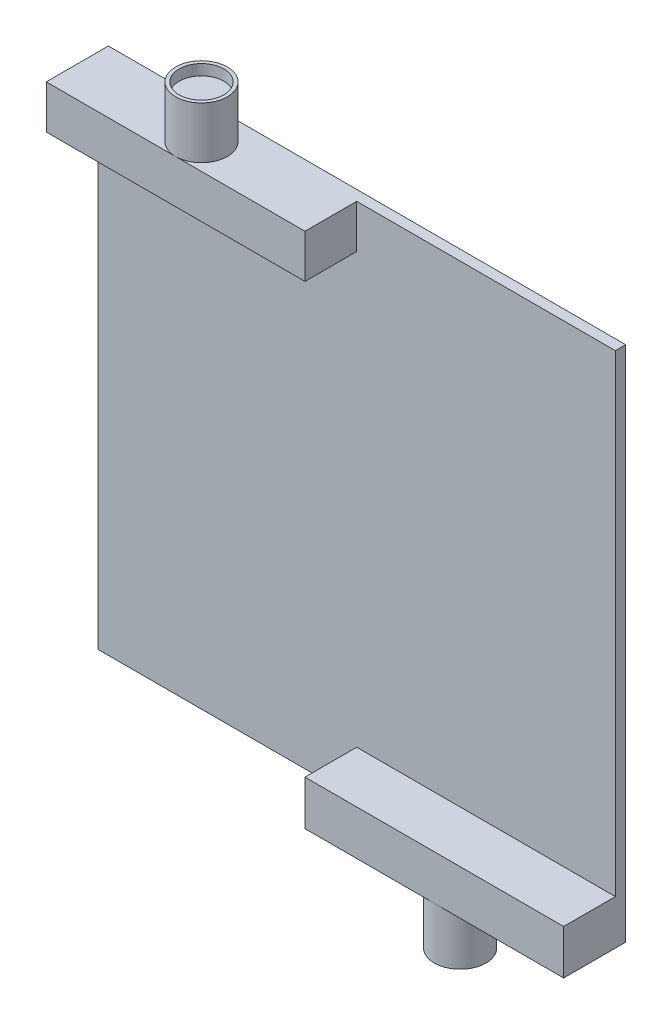
ISO-10303-21;
HEADER;
FILE_DESCRIPTION(('STEP AP214'),'2;1');
FILE_NAME('part.step','',(''),(''),'','','');
FILE_SCHEMA(('AUTOMOTIVE_DESIGN { 1 0 10303 214 1 1 1 1 }'));
ENDSEC;
DATA;
#1=APPLICATION_CONTEXT('core data for automotive mechanical design processes');
#2=APPLICATION_PROTOCOL_DEFINITION('international standard','automotive_design',2000,#1);
#3=PRODUCT_CONTEXT('',#1,'mechanical');
#4=PRODUCT('Part','Part','',(#3));
#5=PRODUCT_RELATED_PRODUCT_CATEGORY('part','',(#4));
#6=PRODUCT_DEFINITION_FORMATION('','',#4);
#7=PRODUCT_DEFINITION_CONTEXT('part definition',#1,'design');
#8=PRODUCT_DEFINITION('design','',#6,#7);
#9=PRODUCT_DEFINITION_SHAPE('','',#8);
#10=(LENGTH_UNIT() NAMED_UNIT(*) SI_UNIT(.MILLI.,.METRE.));
#11=(NAMED_UNIT(*) PLANE_ANGLE_UNIT() SI_UNIT($,.RADIAN.));
#12=(NAMED_UNIT(*) SI_UNIT($,.STERADIAN.) SOLID_ANGLE_UNIT());
#13=UNCERTAINTY_MEASURE_WITH_UNIT(LENGTH_MEASURE(1.E-05),#10,'distance_accuracy_value','');
#14=(GEOMETRIC_REPRESENTATION_CONTEXT(3) GLOBAL_UNCERTAINTY_ASSIGNED_CONTEXT((#13)) GLOBAL_UNIT_ASSIGNED_CONTEXT((#10,
#11,#12)) REPRESENTATION_CONTEXT('',''));
#15=CARTESIAN_POINT('',(0.,0.,0.));
#16=DIRECTION('',(0.,0.,1.));
#17=DIRECTION('',(1.,0.,0.));
#18=AXIS2_PLACEMENT_3D('',#15,#16,#17);
#19=CARTESIAN_POINT('',(0.,0.,3.));
#20=DIRECTION('',(0.,0.,-1.));
#21=DIRECTION('',(-1.,0.,0.));
#22=AXIS2_PLACEMENT_3D('',#19,#20,#21);
#23=PLANE('',#22);
#24=DIRECTION('',(-1.,0.,0.));
#25=VECTOR('',#24,1.);
#26=CARTESIAN_POINT('',(75.,-62.059544417906,3.));
#27=LINE('',#26,#25);
#28=CARTESIAN_POINT('',(75.,-62.059544417906,3.));
#29=VERTEX_POINT('',#28);
#30=CARTESIAN_POINT('',(0.,-62.059544417906,3.));
#31=VERTEX_POINT('',#30);
#32=EDGE_CURVE('E54',#29,#31,#27,.T.);
#33=ORIENTED_EDGE('',*,*,#32,.F.);
#34=DIRECTION('',(0.,1.,0.));
#35=VECTOR('',#34,1.);
#36=CARTESIAN_POINT('',(75.,-75.,3.));
#37=LINE('',#36,#35);
#38=CARTESIAN_POINT('',(75.,75.,3.));
#39=VERTEX_POINT('',#38);
#40=EDGE_CURVE('E188',#29,#39,#37,.T.);
#41=ORIENTED_EDGE('',*,*,#40,.T.);
#42=DIRECTION('',(-1.,0.,0.));
#43=VECTOR('',#42,1.);
#44=CARTESIAN_POINT('',(-75.,75.,3.));
#45=LINE('',#44,#43);
#46=CARTESIAN_POINT('',(0.,75.,3.));
#47=VERTEX_POINT('',#46);
#48=EDGE_CURVE('E190',#39,#47,#45,.T.);
#49=ORIENTED_EDGE('',*,*,#48,.T.);
#50=DIRECTION('',(0.,1.,0.));
#51=VECTOR('',#50,1.);
#52=CARTESIAN_POINT('',(0.,75.,3.));
#53=LINE('',#52,#51);
#54=CARTESIAN_POINT('',(0.,62.4039015801827,3.));
#55=VERTEX_POINT('',#54);
#56=EDGE_CURVE('E160',#55,#47,#53,.T.);
#57=ORIENTED_EDGE('',*,*,#56,.F.);
#58=DIRECTION('',(1.,0.,0.));
#59=VECTOR('',#58,1.);
#60=CARTESIAN_POINT('',(0.,62.4039015801827,3.));
#61=LINE('',#60,#59);
#62=CARTESIAN_POINT('',(-75.,62.4039015801827,3.));
#63=VERTEX_POINT('',#62);
#64=EDGE_CURVE('E167',#63,#55,#61,.T.);
#65=ORIENTED_EDGE('',*,*,#64,.F.);
#66=DIRECTION('',(0.,-1.,0.));
#67=VECTOR('',#66,1.);
#68=CARTESIAN_POINT('',(-75.,-75.,3.));
#69=LINE('',#68,#67);
#70=CARTESIAN_POINT('',(-75.,-75.,3.));
#71=VERTEX_POINT('',#70);
#72=EDGE_CURVE('E193',#63,#71,#69,.T.);
#73=ORIENTED_EDGE('',*,*,#72,.T.);
#74=DIRECTION('',(1.,0.,0.));
#75=VECTOR('',#74,1.);
#76=CARTESIAN_POINT('',(-75.,-75.,3.));
#77=LINE('',#76,#75);
#78=CARTESIAN_POINT('',(0.,-75.,3.));
#79=VERTEX_POINT('',#78);
#80=EDGE_CURVE('E195',#71,#79,#77,.T.);
#81=ORIENTED_EDGE('',*,*,#80,.T.);
#82=DIRECTION('',(0.,-1.,0.));
#83=VECTOR('',#82,1.);
#84=CARTESIAN_POINT('',(0.,-75.,3.));
#85=LINE('',#84,#83);
#86=EDGE_CURVE('E50',#31,#79,#85,.T.);
#87=ORIENTED_EDGE('',*,*,#86,.F.);
#88=EDGE_LOOP('',(#33,#41,#49,#57,#65,#73,#81,#87));
#89=FACE_BOUND('',#88,.T.);
#90=ADVANCED_FACE('F35',(#89),#23,.F.);
#91=CARTESIAN_POINT('',(75.,-75.,3.));
#92=DIRECTION('',(-1.,0.,0.));
#93=DIRECTION('',(0.,0.,1.));
#94=AXIS2_PLACEMENT_3D('',#91,#92,#93);
#95=PLANE('',#94);
#96=DIRECTION('',(0.,1.,0.));
#97=VECTOR('',#96,1.);
#98=CARTESIAN_POINT('',(75.,-75.,0.));
#99=LINE('',#98,#97);
#100=CARTESIAN_POINT('',(75.,-75.,0.));
#101=VERTEX_POINT('',#100);
#102=CARTESIAN_POINT('',(75.,75.,0.));
#103=VERTEX_POINT('',#102);
#104=EDGE_CURVE('E187',#101,#103,#99,.T.);
#105=ORIENTED_EDGE('',*,*,#104,.T.);
#106=DIRECTION('',(0.,0.,-1.));
#107=VECTOR('',#106,1.);
#108=CARTESIAN_POINT('',(75.,75.,3.));
#109=LINE('',#108,#107);
#110=EDGE_CURVE('E11',#39,#103,#109,.T.);
#111=ORIENTED_EDGE('',*,*,#110,.F.);
#112=ORIENTED_EDGE('',*,*,#40,.F.);
#113=DIRECTION('',(0.,0.,-1.));
#114=VECTOR('',#113,1.);
#115=CARTESIAN_POINT('',(75.,-62.059544417906,18.));
#116=LINE('',#115,#114);
#117=CARTESIAN_POINT('',(75.,-62.059544417906,18.));
#118=VERTEX_POINT('',#117);
#119=EDGE_CURVE('E147',#118,#29,#116,.T.);
#120=ORIENTED_EDGE('',*,*,#119,.F.);
#121=DIRECTION('',(0.,1.,0.));
#122=VECTOR('',#121,1.);
#123=CARTESIAN_POINT('',(75.,-75.,18.));
#124=LINE('',#123,#122);
#125=CARTESIAN_POINT('',(75.,-75.,18.));
#126=VERTEX_POINT('',#125);
#127=EDGE_CURVE('E142',#126,#118,#124,.T.);
#128=ORIENTED_EDGE('',*,*,#127,.F.);
#129=DIRECTION('',(0.,0.,-1.));
#130=VECTOR('',#129,1.);
#131=CARTESIAN_POINT('',(75.,-75.,3.));
#132=LINE('',#131,#130);
#133=EDGE_CURVE('E133',#126,#101,#132,.T.);
#134=ORIENTED_EDGE('',*,*,#133,.T.);
#135=EDGE_LOOP('',(#105,#111,#112,#120,#128,#134));
#136=FACE_BOUND('',#135,.T.);
#137=ADVANCED_FACE('F37',(#136),#95,.F.);
#138=CARTESIAN_POINT('',(-75.,75.,3.));
#139=DIRECTION('',(0.,-1.,0.));
#140=DIRECTION('',(0.,0.,-1.));
#141=AXIS2_PLACEMENT_3D('',#138,#139,#140);
#142=PLANE('',#141);
#143=DIRECTION('',(-1.,0.,0.));
#144=VECTOR('',#143,1.);
#145=CARTESIAN_POINT('',(0.,75.,18.));
#146=LINE('',#145,#144);
#147=CARTESIAN_POINT('',(-37.5,75.,17.9999999999999));
#148=VERTEX_POINT('',#147);
#149=CARTESIAN_POINT('',(-75.,75.,18.));
#150=VERTEX_POINT('',#149);
#151=EDGE_CURVE('E166',#148,#150,#146,.T.);
#152=ORIENTED_EDGE('',*,*,#151,.F.);
#153=CARTESIAN_POINT('',(-37.5,75.,10.5));
#154=DIRECTION('',(0.,1.,0.));
#155=DIRECTION('',(0.,0.,1.));
#156=AXIS2_PLACEMENT_3D('',#153,#154,#155);
#157=CIRCLE('',#156,7.49999999999995);
#158=EDGE_CURVE('E154',#148,#148,#157,.T.);
#159=ORIENTED_EDGE('',*,*,#158,.F.);
#160=CARTESIAN_POINT('',(0.,75.,18.));
#161=VERTEX_POINT('',#160);
#162=EDGE_CURVE('E168',#161,#148,#146,.T.);
#163=ORIENTED_EDGE('',*,*,#162,.F.);
#164=DIRECTION('',(0.,0.,-1.));
#165=VECTOR('',#164,1.);
#166=CARTESIAN_POINT('',(0.,75.,18.));
#167=LINE('',#166,#165);
#168=EDGE_CURVE('E184',#161,#47,#167,.T.);
#169=ORIENTED_EDGE('',*,*,#168,.T.);
#170=ORIENTED_EDGE('',*,*,#48,.F.);
#171=ORIENTED_EDGE('',*,*,#110,.T.);
#172=DIRECTION('',(-1.,0.,0.));
#173=VECTOR('',#172,1.);
#174=CARTESIAN_POINT('',(-75.,75.,0.));
#175=LINE('',#174,#173);
#176=CARTESIAN_POINT('',(-75.,75.,0.));
#177=VERTEX_POINT('',#176);
#178=EDGE_CURVE('E199',#103,#177,#175,.T.);
#179=ORIENTED_EDGE('',*,*,#178,.T.);
#180=DIRECTION('',(0.,0.,-1.));
#181=VECTOR('',#180,1.);
#182=CARTESIAN_POINT('',(-75.,75.,3.));
#183=LINE('',#182,#181);
#184=EDGE_CURVE('E43',#150,#177,#183,.T.);
#185=ORIENTED_EDGE('',*,*,#184,.F.);
#186=EDGE_LOOP('',(#152,#159,#163,#169,#170,#171,#179,#185));
#187=FACE_BOUND('',#186,.T.);
#188=ADVANCED_FACE('F265',(#187),#142,.F.);
#189=CARTESIAN_POINT('',(-75.,-75.,3.));
#190=DIRECTION('',(1.,0.,0.));
#191=DIRECTION('',(0.,0.,-1.));
#192=AXIS2_PLACEMENT_3D('',#189,#190,#191);
#193=PLANE('',#192);
#194=DIRECTION('',(0.,-1.,0.));
#195=VECTOR('',#194,1.);
#196=CARTESIAN_POINT('',(-75.,-75.,0.));
#197=LINE('',#196,#195);
#198=CARTESIAN_POINT('',(-75.,-75.,0.));
#199=VERTEX_POINT('',#198);
#200=EDGE_CURVE('E201',#177,#199,#197,.T.);
#201=ORIENTED_EDGE('',*,*,#200,.T.);
#202=DIRECTION('',(0.,0.,-1.));
#203=VECTOR('',#202,1.);
#204=CARTESIAN_POINT('',(-75.,-75.,3.));
#205=LINE('',#204,#203);
#206=EDGE_CURVE('E205',#71,#199,#205,.T.);
#207=ORIENTED_EDGE('',*,*,#206,.F.);
#208=ORIENTED_EDGE('',*,*,#72,.F.);
#209=DIRECTION('',(0.,0.,-1.));
#210=VECTOR('',#209,1.);
#211=CARTESIAN_POINT('',(-75.,62.4039015801827,18.));
#212=LINE('',#211,#210);
#213=CARTESIAN_POINT('',(-75.,62.4039015801827,18.));
#214=VERTEX_POINT('',#213);
#215=EDGE_CURVE('E181',#214,#63,#212,.T.);
#216=ORIENTED_EDGE('',*,*,#215,.F.);
#217=DIRECTION('',(0.,-1.,0.));
#218=VECTOR('',#217,1.);
#219=CARTESIAN_POINT('',(-75.,75.,18.));
#220=LINE('',#219,#218);
#221=EDGE_CURVE('E170',#150,#214,#220,.T.);
#222=ORIENTED_EDGE('',*,*,#221,.F.);
#223=ORIENTED_EDGE('',*,*,#184,.T.);
#224=EDGE_LOOP('',(#201,#207,#208,#216,#222,#223));
#225=FACE_BOUND('',#224,.T.);
#226=ADVANCED_FACE('F212',(#225),#193,.F.);
#227=CARTESIAN_POINT('',(-75.,-75.,3.));
#228=DIRECTION('',(0.,1.,0.));
#229=DIRECTION('',(0.,0.,1.));
#230=AXIS2_PLACEMENT_3D('',#227,#228,#229);
#231=PLANE('',#230);
#232=DIRECTION('',(1.,0.,0.));
#233=VECTOR('',#232,1.);
#234=CARTESIAN_POINT('',(75.,-75.,18.));
#235=LINE('',#234,#233);
#236=CARTESIAN_POINT('',(37.5,-75.,18.));
#237=VERTEX_POINT('',#236);
#238=EDGE_CURVE('E119',#237,#126,#235,.T.);
#239=ORIENTED_EDGE('',*,*,#238,.F.);
#240=CARTESIAN_POINT('',(37.5,-75.,10.5));
#241=DIRECTION('',(0.,-1.,0.));
#242=DIRECTION('',(0.,0.,-1.));
#243=AXIS2_PLACEMENT_3D('',#240,#241,#242);
#244=CIRCLE('',#243,7.49999999999996);
#245=EDGE_CURVE('E131',#237,#237,#244,.T.);
#246=ORIENTED_EDGE('',*,*,#245,.F.);
#247=CARTESIAN_POINT('',(0.,-75.,18.));
#248=VERTEX_POINT('',#247);
#249=EDGE_CURVE('E115',#248,#237,#235,.T.);
#250=ORIENTED_EDGE('',*,*,#249,.F.);
#251=DIRECTION('',(0.,0.,-1.));
#252=VECTOR('',#251,1.);
#253=CARTESIAN_POINT('',(0.,-75.,18.));
#254=LINE('',#253,#252);
#255=EDGE_CURVE('E127',#248,#79,#254,.T.);
#256=ORIENTED_EDGE('',*,*,#255,.T.);
#257=ORIENTED_EDGE('',*,*,#80,.F.);
#258=ORIENTED_EDGE('',*,*,#206,.T.);
#259=DIRECTION('',(1.,0.,0.));
#260=VECTOR('',#259,1.);
#261=CARTESIAN_POINT('',(-75.,-75.,0.));
#262=LINE('',#261,#260);
#263=EDGE_CURVE('E191',#199,#101,#262,.T.);
#264=ORIENTED_EDGE('',*,*,#263,.T.);
#265=ORIENTED_EDGE('',*,*,#133,.F.);
#266=EDGE_LOOP('',(#239,#246,#250,#256,#257,#258,#264,#265));
#267=FACE_BOUND('',#266,.T.);
#268=ADVANCED_FACE('F129',(#267),#231,.F.);
#269=CARTESIAN_POINT('',(0.,0.,0.));
#270=DIRECTION('',(0.,0.,-1.));
#271=DIRECTION('',(-1.,0.,0.));
#272=AXIS2_PLACEMENT_3D('',#269,#270,#271);
#273=PLANE('',#272);
#274=ORIENTED_EDGE('',*,*,#104,.F.);
#275=ORIENTED_EDGE('',*,*,#263,.F.);
#276=ORIENTED_EDGE('',*,*,#200,.F.);
#277=ORIENTED_EDGE('',*,*,#178,.F.);
#278=EDGE_LOOP('',(#274,#275,#276,#277));
#279=FACE_BOUND('',#278,.T.);
#280=ADVANCED_FACE('F220',(#279),#273,.T.);
#281=CARTESIAN_POINT('',(0.,75.,18.));
#282=DIRECTION('',(-1.,0.,0.));
#283=DIRECTION('',(0.,0.,1.));
#284=AXIS2_PLACEMENT_3D('',#281,#282,#283);
#285=PLANE('',#284);
#286=ORIENTED_EDGE('',*,*,#56,.T.);
#287=ORIENTED_EDGE('',*,*,#168,.F.);
#288=DIRECTION('',(0.,1.,0.));
#289=VECTOR('',#288,1.);
#290=CARTESIAN_POINT('',(0.,75.,18.));
#291=LINE('',#290,#289);
#292=CARTESIAN_POINT('',(0.,62.4039015801827,18.));
#293=VERTEX_POINT('',#292);
#294=EDGE_CURVE('E163',#293,#161,#291,.T.);
#295=ORIENTED_EDGE('',*,*,#294,.F.);
#296=DIRECTION('',(0.,0.,-1.));
#297=VECTOR('',#296,1.);
#298=CARTESIAN_POINT('',(0.,62.4039015801827,18.));
#299=LINE('',#298,#297);
#300=EDGE_CURVE('E174',#293,#55,#299,.T.);
#301=ORIENTED_EDGE('',*,*,#300,.T.);
#302=EDGE_LOOP('',(#286,#287,#295,#301));
#303=FACE_BOUND('',#302,.T.);
#304=ADVANCED_FACE('F268',(#303),#285,.F.);
#305=CARTESIAN_POINT('',(0.,62.4039015801827,18.));
#306=DIRECTION('',(0.,1.,0.));
#307=DIRECTION('',(0.,0.,1.));
#308=AXIS2_PLACEMENT_3D('',#305,#306,#307);
#309=PLANE('',#308);
#310=ORIENTED_EDGE('',*,*,#64,.T.);
#311=ORIENTED_EDGE('',*,*,#300,.F.);
#312=DIRECTION('',(1.,0.,0.));
#313=VECTOR('',#312,1.);
#314=CARTESIAN_POINT('',(0.,62.4039015801827,18.));
#315=LINE('',#314,#313);
#316=EDGE_CURVE('E172',#214,#293,#315,.T.);
#317=ORIENTED_EDGE('',*,*,#316,.F.);
#318=ORIENTED_EDGE('',*,*,#215,.T.);
#319=EDGE_LOOP('',(#310,#311,#317,#318));
#320=FACE_BOUND('',#319,.T.);
#321=ADVANCED_FACE('F288',(#320),#309,.F.);
#322=CARTESIAN_POINT('',(0.,0.,18.));
#323=DIRECTION('',(0.,0.,-1.));
#324=DIRECTION('',(-1.,0.,0.));
#325=AXIS2_PLACEMENT_3D('',#322,#323,#324);
#326=PLANE('',#325);
#327=ORIENTED_EDGE('',*,*,#294,.T.);
#328=ORIENTED_EDGE('',*,*,#162,.T.);
#329=ORIENTED_EDGE('',*,*,#151,.T.);
#330=ORIENTED_EDGE('',*,*,#221,.T.);
#331=ORIENTED_EDGE('',*,*,#316,.T.);
#332=EDGE_LOOP('',(#327,#328,#329,#330,#331));
#333=FACE_BOUND('',#332,.T.);
#334=ADVANCED_FACE('F280',(#333),#326,.F.);
#335=CARTESIAN_POINT('',(-37.5,90.,10.5));
#336=DIRECTION('',(0.,-1.,0.));
#337=DIRECTION('',(0.,0.,-1.));
#338=AXIS2_PLACEMENT_3D('',#335,#336,#337);
#339=CYLINDRICAL_SURFACE('',#338,7.49999999999995);
#340=CARTESIAN_POINT('',(-37.5,90.,10.5));
#341=DIRECTION('',(0.,1.,0.));
#342=DIRECTION('',(0.,0.,1.));
#343=AXIS2_PLACEMENT_3D('',#340,#341,#342);
#344=CIRCLE('',#343,7.49999999999995);
#345=CARTESIAN_POINT('',(-37.5,90.,17.9999999999999));
#346=VERTEX_POINT('',#345);
#347=EDGE_CURVE('E157',#346,#346,#344,.T.);
#348=ORIENTED_EDGE('',*,*,#347,.F.);
#349=EDGE_LOOP('',(#348));
#350=FACE_BOUND('',#349,.T.);
#351=ORIENTED_EDGE('',*,*,#158,.T.);
#352=EDGE_LOOP('',(#351));
#353=FACE_BOUND('',#352,.T.);
#354=ADVANCED_FACE('F312',(#350,#353),#339,.T.);
#355=CARTESIAN_POINT('',(-37.5,90.,10.5));
#356=DIRECTION('',(0.,1.,0.));
#357=DIRECTION('',(0.,0.,1.));
#358=AXIS2_PLACEMENT_3D('',#355,#356,#357);
#359=PLANE('',#358);
#360=CARTESIAN_POINT('',(-37.5,90.,10.5));
#361=DIRECTION('',(0.,1.,0.));
#362=DIRECTION('',(0.,0.,1.));
#363=AXIS2_PLACEMENT_3D('',#360,#361,#362);
#364=CIRCLE('',#363,6.5);
#365=CARTESIAN_POINT('',(-37.5,90.,17.));
#366=VERTEX_POINT('',#365);
#367=EDGE_CURVE('E150',#366,#366,#364,.T.);
#368=ORIENTED_EDGE('',*,*,#367,.F.);
#369=EDGE_LOOP('',(#368));
#370=FACE_BOUND('',#369,.T.);
#371=ORIENTED_EDGE('',*,*,#347,.T.);
#372=EDGE_LOOP('',(#371));
#373=FACE_BOUND('',#372,.T.);
#374=ADVANCED_FACE('F308',(#370,#373),#359,.T.);
#375=CARTESIAN_POINT('',(-37.5,86.9,10.5));
#376=DIRECTION('',(0.,1.,0.));
#377=DIRECTION('',(0.,0.,1.));
#378=AXIS2_PLACEMENT_3D('',#375,#376,#377);
#379=CYLINDRICAL_SURFACE('',#378,6.5);
#380=CARTESIAN_POINT('',(-37.5,86.9,10.5));
#381=DIRECTION('',(0.,1.,0.));
#382=DIRECTION('',(0.,0.,1.));
#383=AXIS2_PLACEMENT_3D('',#380,#381,#382);
#384=CIRCLE('',#383,6.5);
#385=CARTESIAN_POINT('',(-37.5,86.9,17.));
#386=VERTEX_POINT('',#385);
#387=EDGE_CURVE('E151',#386,#386,#384,.T.);
#388=CARTESIAN_POINT('',(-37.5,86.9,17.));
#389=CARTESIAN_POINT('',(-37.5,86.9322916666666,17.));
#390=CARTESIAN_POINT('',(-37.5,86.9645833333333,17.));
#391=CARTESIAN_POINT('',(-37.5,87.0291666666666,17.));
#392=CARTESIAN_POINT('',(-37.5,87.0614583333333,17.));
#393=CARTESIAN_POINT('',(-37.5,87.1260416666666,17.));
#394=CARTESIAN_POINT('',(-37.5,87.1583333333333,17.));
#395=CARTESIAN_POINT('',(-37.5,87.2229166666666,17.));
#396=CARTESIAN_POINT('',(-37.5,87.2552083333333,17.));
#397=CARTESIAN_POINT('',(-37.5,87.3197916666666,17.));
#398=CARTESIAN_POINT('',(-37.5,87.3520833333333,17.));
#399=CARTESIAN_POINT('',(-37.5,87.4166666666666,17.));
#400=CARTESIAN_POINT('',(-37.5,87.4489583333333,17.));
#401=CARTESIAN_POINT('',(-37.5,87.5135416666666,17.));
#402=CARTESIAN_POINT('',(-37.5,87.5458333333333,17.));
#403=CARTESIAN_POINT('',(-37.5,87.6104166666666,17.));
#404=CARTESIAN_POINT('',(-37.5,87.6427083333333,17.));
#405=CARTESIAN_POINT('',(-37.5,87.7072916666666,17.));
#406=CARTESIAN_POINT('',(-37.5,87.7395833333333,17.));
#407=CARTESIAN_POINT('',(-37.5,87.8041666666666,17.));
#408=CARTESIAN_POINT('',(-37.5,87.8364583333333,17.));
#409=CARTESIAN_POINT('',(-37.5,87.9010416666666,17.));
#410=CARTESIAN_POINT('',(-37.5,87.9333333333333,17.));
#411=CARTESIAN_POINT('',(-37.5,87.9979166666667,17.));
#412=CARTESIAN_POINT('',(-37.5,88.0302083333333,17.));
#413=CARTESIAN_POINT('',(-37.5,88.0947916666666,17.));
#414=CARTESIAN_POINT('',(-37.5,88.1270833333333,17.));
#415=CARTESIAN_POINT('',(-37.5,88.1916666666666,17.));
#416=CARTESIAN_POINT('',(-37.5,88.2239583333333,17.));
#417=CARTESIAN_POINT('',(-37.5,88.2885416666666,17.));
#418=CARTESIAN_POINT('',(-37.5,88.3208333333333,17.));
#419=CARTESIAN_POINT('',(-37.5,88.3854166666666,17.));
#420=CARTESIAN_POINT('',(-37.5,88.4177083333333,17.));
#421=CARTESIAN_POINT('',(-37.5,88.4822916666666,17.));
#422=CARTESIAN_POINT('',(-37.5,88.5145833333333,17.));
#423=CARTESIAN_POINT('',(-37.5,88.5791666666666,17.));
#424=CARTESIAN_POINT('',(-37.5,88.6114583333333,17.));
#425=CARTESIAN_POINT('',(-37.5,88.6760416666666,17.));
#426=CARTESIAN_POINT('',(-37.5,88.7083333333333,17.));
#427=CARTESIAN_POINT('',(-37.5,88.7729166666666,17.));
#428=CARTESIAN_POINT('',(-37.5,88.8052083333333,17.));
#429=CARTESIAN_POINT('',(-37.5,88.8697916666666,17.));
#430=CARTESIAN_POINT('',(-37.5,88.9020833333333,17.));
#431=CARTESIAN_POINT('',(-37.5,88.9666666666666,17.));
#432=CARTESIAN_POINT('',(-37.5,88.9989583333333,17.));
#433=CARTESIAN_POINT('',(-37.5,89.0635416666667,17.));
#434=CARTESIAN_POINT('',(-37.5,89.0958333333333,17.));
#435=CARTESIAN_POINT('',(-37.5,89.1604166666666,17.));
#436=CARTESIAN_POINT('',(-37.5,89.1927083333333,17.));
#437=CARTESIAN_POINT('',(-37.5,89.2572916666666,17.));
#438=CARTESIAN_POINT('',(-37.5,89.2895833333333,17.));
#439=CARTESIAN_POINT('',(-37.5,89.3541666666667,17.));
#440=CARTESIAN_POINT('',(-37.5,89.3864583333333,17.));
#441=CARTESIAN_POINT('',(-37.5,89.4510416666667,17.));
#442=CARTESIAN_POINT('',(-37.5,89.4833333333333,17.));
#443=CARTESIAN_POINT('',(-37.5,89.5479166666666,17.));
#444=CARTESIAN_POINT('',(-37.5,89.5802083333333,17.));
#445=CARTESIAN_POINT('',(-37.5,89.6447916666666,17.));
#446=CARTESIAN_POINT('',(-37.5,89.6770833333333,17.));
#447=CARTESIAN_POINT('',(-37.5,89.7416666666666,17.));
#448=CARTESIAN_POINT('',(-37.5,89.7739583333333,17.));
#449=CARTESIAN_POINT('',(-37.5,89.8385416666666,17.));
#450=CARTESIAN_POINT('',(-37.5,89.8708333333333,17.));
#451=CARTESIAN_POINT('',(-37.5,89.9354166666666,17.));
#452=CARTESIAN_POINT('',(-37.5,89.9677083333333,17.));
#453=CARTESIAN_POINT('',(-37.5,90.,17.));
#454=B_SPLINE_CURVE_WITH_KNOTS('',3,(#388,#389,#390,#391,#392,#393,#394,#395,#396,#397,#398,
#399,#400,#401,#402,#403,#404,#405,#406,#407,#408,#409,#410,#411,#412,#413,#414,#415,#416,#417,
#418,#419,#420,#421,#422,#423,#424,#425,#426,#427,#428,#429,#430,#431,#432,#433,#434,#435,#436,
#437,#438,#439,#440,#441,#442,#443,#444,#445,#446,#447,#448,#449,#450,#451,#452,#453),
.UNSPECIFIED.,.F.,.F.,(4,2,2,2,2,2,2,2,2,2,2,2,2,2,2,2,2,2,2,2,2,2,2,2,2,2,2,2,2,2,2,2,4),(0.,
0.0968750000000101,0.193750000000006,0.290625000000003,0.387500000000013,0.484375000000009,
0.581250000000005,0.678125000000002,0.775000000000012,0.871875000000008,0.968750000000004,
1.06562500000001,1.16250000000001,1.25937500000001,1.35625,1.45312500000001,1.55000000000001,
1.64687500000001,1.74375000000002,1.84062500000001,1.93750000000001,2.03437500000001,
2.13125000000002,2.22812500000001,2.32500000000001,2.42187500000002,2.51875000000001,
2.61562500000001,2.71250000000001,2.80937500000002,2.90625000000001,3.00312500000001,
3.10000000000002),.UNSPECIFIED.);
#455=EDGE_CURVE('BSEAM302',#386,#366,#454,.T.);
#456=ORIENTED_EDGE('',*,*,#387,.F.);
#457=ORIENTED_EDGE('',*,*,#367,.T.);
#458=ORIENTED_EDGE('',*,*,#455,.T.);
#459=ORIENTED_EDGE('',*,*,#455,.F.);
#460=EDGE_LOOP('',(#456,#458,#457,#459));
#461=FACE_BOUND('',#460,.T.);
#462=ADVANCED_FACE('F302',(#461),#379,.F.);
#463=CARTESIAN_POINT('',(-37.5,86.9,10.5));
#464=DIRECTION('',(0.,1.,0.));
#465=DIRECTION('',(0.,0.,1.));
#466=AXIS2_PLACEMENT_3D('',#463,#464,#465);
#467=PLANE('',#466);
#468=ORIENTED_EDGE('',*,*,#387,.T.);
#469=EDGE_LOOP('',(#468));
#470=FACE_BOUND('',#469,.T.);
#471=ADVANCED_FACE('F295',(#470),#467,.T.);
#472=CARTESIAN_POINT('',(75.,-62.059544417906,18.));
#473=DIRECTION('',(0.,-1.,0.));
#474=DIRECTION('',(0.,0.,-1.));
#475=AXIS2_PLACEMENT_3D('',#472,#473,#474);
#476=PLANE('',#475);
#477=ORIENTED_EDGE('',*,*,#32,.T.);
#478=DIRECTION('',(0.,0.,-1.));
#479=VECTOR('',#478,1.);
#480=CARTESIAN_POINT('',(0.,-62.059544417906,18.));
#481=LINE('',#480,#479);
#482=CARTESIAN_POINT('',(0.,-62.059544417906,18.));
#483=VERTEX_POINT('',#482);
#484=EDGE_CURVE('E144',#483,#31,#481,.T.);
#485=ORIENTED_EDGE('',*,*,#484,.F.);
#486=DIRECTION('',(-1.,0.,0.));
#487=VECTOR('',#486,1.);
#488=CARTESIAN_POINT('',(75.,-62.059544417906,18.));
#489=LINE('',#488,#487);
#490=EDGE_CURVE('E135',#118,#483,#489,.T.);
#491=ORIENTED_EDGE('',*,*,#490,.F.);
#492=ORIENTED_EDGE('',*,*,#119,.T.);
#493=EDGE_LOOP('',(#477,#485,#491,#492));
#494=FACE_BOUND('',#493,.T.);
#495=ADVANCED_FACE('F293',(#494),#476,.F.);
#496=CARTESIAN_POINT('',(0.,-75.,18.));
#497=DIRECTION('',(1.,0.,0.));
#498=DIRECTION('',(0.,0.,-1.));
#499=AXIS2_PLACEMENT_3D('',#496,#497,#498);
#500=PLANE('',#499);
#501=ORIENTED_EDGE('',*,*,#86,.T.);
#502=ORIENTED_EDGE('',*,*,#255,.F.);
#503=DIRECTION('',(0.,-1.,0.));
#504=VECTOR('',#503,1.);
#505=CARTESIAN_POINT('',(0.,-75.,18.));
#506=LINE('',#505,#504);
#507=EDGE_CURVE('E122',#483,#248,#506,.T.);
#508=ORIENTED_EDGE('',*,*,#507,.F.);
#509=ORIENTED_EDGE('',*,*,#484,.T.);
#510=EDGE_LOOP('',(#501,#502,#508,#509));
#511=FACE_BOUND('',#510,.T.);
#512=ADVANCED_FACE('F258',(#511),#500,.F.);
#513=CARTESIAN_POINT('',(0.,0.,18.));
#514=DIRECTION('',(0.,0.,1.));
#515=DIRECTION('',(1.,0.,0.));
#516=AXIS2_PLACEMENT_3D('',#513,#514,#515);
#517=PLANE('',#516);
#518=ORIENTED_EDGE('',*,*,#127,.T.);
#519=ORIENTED_EDGE('',*,*,#490,.T.);
#520=ORIENTED_EDGE('',*,*,#507,.T.);
#521=ORIENTED_EDGE('',*,*,#249,.T.);
#522=ORIENTED_EDGE('',*,*,#238,.T.);
#523=EDGE_LOOP('',(#518,#519,#520,#521,#522));
#524=FACE_BOUND('',#523,.T.);
#525=ADVANCED_FACE('F118',(#524),#517,.T.);
#526=CARTESIAN_POINT('',(37.5,-90.,10.5));
#527=DIRECTION('',(0.,1.,0.));
#528=DIRECTION('',(0.,0.,1.));
#529=AXIS2_PLACEMENT_3D('',#526,#527,#528);
#530=CYLINDRICAL_SURFACE('',#529,7.49999999999996);
#531=CARTESIAN_POINT('',(37.5,-90.,10.5));
#532=DIRECTION('',(0.,-1.,0.));
#533=DIRECTION('',(0.,0.,-1.));
#534=AXIS2_PLACEMENT_3D('',#531,#532,#533);
#535=CIRCLE('',#534,7.49999999999996);
#536=CARTESIAN_POINT('',(37.5,-90.,3.00000000000004));
#537=VERTEX_POINT('',#536);
#538=EDGE_CURVE('E140',#537,#537,#535,.T.);
#539=ORIENTED_EDGE('',*,*,#538,.F.);
#540=EDGE_LOOP('',(#539));
#541=FACE_BOUND('',#540,.T.);
#542=ORIENTED_EDGE('',*,*,#245,.T.);
#543=EDGE_LOOP('',(#542));
#544=FACE_BOUND('',#543,.T.);
#545=ADVANCED_FACE('F248',(#541,#544),#530,.T.);
#546=CARTESIAN_POINT('',(37.5,-90.,10.5));
#547=DIRECTION('',(0.,-1.,0.));
#548=DIRECTION('',(0.,0.,-1.));
#549=AXIS2_PLACEMENT_3D('',#546,#547,#548);
#550=PLANE('',#549);
#551=CARTESIAN_POINT('',(37.5,-90.,10.5));
#552=DIRECTION('',(0.,-1.,0.));
#553=DIRECTION('',(0.,0.,-1.));
#554=AXIS2_PLACEMENT_3D('',#551,#552,#553);
#555=CIRCLE('',#554,6.5);
#556=CARTESIAN_POINT('',(37.5,-90.,4.));
#557=VERTEX_POINT('',#556);
#558=EDGE_CURVE('E231',#557,#557,#555,.T.);
#559=ORIENTED_EDGE('',*,*,#558,.F.);
#560=EDGE_LOOP('',(#559));
#561=FACE_BOUND('',#560,.T.);
#562=ORIENTED_EDGE('',*,*,#538,.T.);
#563=EDGE_LOOP('',(#562));
#564=FACE_BOUND('',#563,.T.);
#565=ADVANCED_FACE('F242',(#561,#564),#550,.T.);
#566=CARTESIAN_POINT('',(37.5,-86.9,10.5));
#567=DIRECTION('',(0.,-1.,0.));
#568=DIRECTION('',(0.,0.,-1.));
#569=AXIS2_PLACEMENT_3D('',#566,#567,#568);
#570=CYLINDRICAL_SURFACE('',#569,6.5);
#571=CARTESIAN_POINT('',(37.5,-86.9,10.5));
#572=DIRECTION('',(0.,-1.,0.));
#573=DIRECTION('',(0.,0.,-1.));
#574=AXIS2_PLACEMENT_3D('',#571,#572,#573);
#575=CIRCLE('',#574,6.5);
#576=CARTESIAN_POINT('',(37.5,-86.9,4.));
#577=VERTEX_POINT('',#576);
#578=EDGE_CURVE('E228',#577,#577,#575,.T.);
#579=CARTESIAN_POINT('',(37.5,-86.9,4.));
#580=CARTESIAN_POINT('',(37.5,-86.9322916666667,4.));
#581=CARTESIAN_POINT('',(37.5,-86.9645833333333,4.));
#582=CARTESIAN_POINT('',(37.5,-87.0291666666667,4.));
#583=CARTESIAN_POINT('',(37.5,-87.0614583333333,4.));
#584=CARTESIAN_POINT('',(37.5,-87.1260416666667,4.));
#585=CARTESIAN_POINT('',(37.5,-87.1583333333333,4.));
#586=CARTESIAN_POINT('',(37.5,-87.2229166666667,4.));
#587=CARTESIAN_POINT('',(37.5,-87.2552083333333,4.));
#588=CARTESIAN_POINT('',(37.5,-87.3197916666667,4.));
#589=CARTESIAN_POINT('',(37.5,-87.3520833333333,4.));
#590=CARTESIAN_POINT('',(37.5,-87.4166666666667,4.));
#591=CARTESIAN_POINT('',(37.5,-87.4489583333333,4.));
#592=CARTESIAN_POINT('',(37.5,-87.5135416666667,4.));
#593=CARTESIAN_POINT('',(37.5,-87.5458333333333,4.));
#594=CARTESIAN_POINT('',(37.5,-87.6104166666667,4.));
#595=CARTESIAN_POINT('',(37.5,-87.6427083333333,4.));
#596=CARTESIAN_POINT('',(37.5,-87.7072916666667,4.));
#597=CARTESIAN_POINT('',(37.5,-87.7395833333333,4.));
#598=CARTESIAN_POINT('',(37.5,-87.8041666666667,4.));
#599=CARTESIAN_POINT('',(37.5,-87.8364583333333,4.));
#600=CARTESIAN_POINT('',(37.5,-87.9010416666667,4.));
#601=CARTESIAN_POINT('',(37.5,-87.9333333333333,4.));
#602=CARTESIAN_POINT('',(37.5,-87.9979166666667,4.));
#603=CARTESIAN_POINT('',(37.5,-88.0302083333333,4.));
#604=CARTESIAN_POINT('',(37.5,-88.0947916666667,4.));
#605=CARTESIAN_POINT('',(37.5,-88.1270833333333,4.));
#606=CARTESIAN_POINT('',(37.5,-88.1916666666667,4.));
#607=CARTESIAN_POINT('',(37.5,-88.2239583333333,4.));
#608=CARTESIAN_POINT('',(37.5,-88.2885416666667,4.));
#609=CARTESIAN_POINT('',(37.5,-88.3208333333333,4.));
#610=CARTESIAN_POINT('',(37.5,-88.3854166666667,4.));
#611=CARTESIAN_POINT('',(37.5,-88.4177083333333,4.));
#612=CARTESIAN_POINT('',(37.5,-88.4822916666667,4.));
#613=CARTESIAN_POINT('',(37.5,-88.5145833333333,4.));
#614=CARTESIAN_POINT('',(37.5,-88.5791666666667,4.));
#615=CARTESIAN_POINT('',(37.5,-88.6114583333333,4.));
#616=CARTESIAN_POINT('',(37.5,-88.6760416666667,4.));
#617=CARTESIAN_POINT('',(37.5,-88.7083333333333,4.));
#618=CARTESIAN_POINT('',(37.5,-88.7729166666667,4.));
#619=CARTESIAN_POINT('',(37.5,-88.8052083333333,4.));
#620=CARTESIAN_POINT('',(37.5,-88.8697916666667,4.));
#621=CARTESIAN_POINT('',(37.5,-88.9020833333333,4.));
#622=CARTESIAN_POINT('',(37.5,-88.9666666666667,4.));
#623=CARTESIAN_POINT('',(37.5,-88.9989583333333,4.));
#624=CARTESIAN_POINT('',(37.5,-89.0635416666667,4.));
#625=CARTESIAN_POINT('',(37.5,-89.0958333333333,4.));
#626=CARTESIAN_POINT('',(37.5,-89.1604166666667,4.));
#627=CARTESIAN_POINT('',(37.5,-89.1927083333333,4.));
#628=CARTESIAN_POINT('',(37.5,-89.2572916666667,4.));
#629=CARTESIAN_POINT('',(37.5,-89.2895833333333,4.));
#630=CARTESIAN_POINT('',(37.5,-89.3541666666667,4.));
#631=CARTESIAN_POINT('',(37.5,-89.3864583333333,4.));
#632=CARTESIAN_POINT('',(37.5,-89.4510416666667,4.));
#633=CARTESIAN_POINT('',(37.5,-89.4833333333333,4.));
#634=CARTESIAN_POINT('',(37.5,-89.5479166666667,4.));
#635=CARTESIAN_POINT('',(37.5,-89.5802083333333,4.));
#636=CARTESIAN_POINT('',(37.5,-89.6447916666667,4.));
#637=CARTESIAN_POINT('',(37.5,-89.6770833333333,4.));
#638=CARTESIAN_POINT('',(37.5,-89.7416666666667,4.));
#639=CARTESIAN_POINT('',(37.5,-89.7739583333333,4.));
#640=CARTESIAN_POINT('',(37.5,-89.8385416666667,4.));
#641=CARTESIAN_POINT('',(37.5,-89.8708333333333,4.));
#642=CARTESIAN_POINT('',(37.5,-89.9354166666667,4.));
#643=CARTESIAN_POINT('',(37.5,-89.9677083333333,4.));
#644=CARTESIAN_POINT('',(37.5,-90.,4.));
#645=B_SPLINE_CURVE_WITH_KNOTS('',3,(#579,#580,#581,#582,#583,#584,#585,#586,#587,#588,#589,
#590,#591,#592,#593,#594,#595,#596,#597,#598,#599,#600,#601,#602,#603,#604,#605,#606,#607,#608,
#609,#610,#611,#612,#613,#614,#615,#616,#617,#618,#619,#620,#621,#622,#623,#624,#625,#626,#627,
#628,#629,#630,#631,#632,#633,#634,#635,#636,#637,#638,#639,#640,#641,#642,#643,#644),
.UNSPECIFIED.,.F.,.F.,(4,2,2,2,2,2,2,2,2,2,2,2,2,2,2,2,2,2,2,2,2,2,2,2,2,2,2,2,2,2,2,2,4),(0.,
0.0968750000000101,0.193750000000006,0.290625000000003,0.387500000000013,0.484375000000009,
0.581250000000005,0.678125000000002,0.775000000000012,0.871875000000008,0.968750000000004,
1.06562500000001,1.16250000000001,1.25937500000001,1.35625,1.45312500000001,1.55000000000001,
1.64687500000001,1.74375000000002,1.84062500000001,1.93750000000001,2.03437500000001,
2.13125000000002,2.22812500000001,2.32500000000001,2.42187500000002,2.51875000000001,
2.61562500000001,2.71250000000001,2.80937500000002,2.90625000000001,3.00312500000001,
3.10000000000002),.UNSPECIFIED.);
#646=EDGE_CURVE('BSEAM239',#577,#557,#645,.T.);
#647=ORIENTED_EDGE('',*,*,#578,.F.);
#648=ORIENTED_EDGE('',*,*,#558,.T.);
#649=ORIENTED_EDGE('',*,*,#646,.T.);
#650=ORIENTED_EDGE('',*,*,#646,.F.);
#651=EDGE_LOOP('',(#647,#649,#648,#650));
#652=FACE_BOUND('',#651,.T.);
#653=ADVANCED_FACE('F239',(#652),#570,.F.);
#654=CARTESIAN_POINT('',(37.5,-86.9,10.5));
#655=DIRECTION('',(0.,-1.,0.));
#656=DIRECTION('',(0.,0.,-1.));
#657=AXIS2_PLACEMENT_3D('',#654,#655,#656);
#658=PLANE('',#657);
#659=ORIENTED_EDGE('',*,*,#578,.T.);
#660=EDGE_LOOP('',(#659));
#661=FACE_BOUND('',#660,.T.);
#662=ADVANCED_FACE('F237',(#661),#658,.T.);
#663=CLOSED_SHELL('',(#90,#137,#188,#226,#268,#280,#304,#321,#334,#354,#374,#462,#471,#495,#512,
#525,#545,#565,#653,#662));
#664=MANIFOLD_SOLID_BREP('B2',#663);
#665=ADVANCED_BREP_SHAPE_REPRESENTATION('',(#18,#664),#14);
#666=SHAPE_DEFINITION_REPRESENTATION(#9,#665);
ENDSEC;
END-ISO-10303-21;
